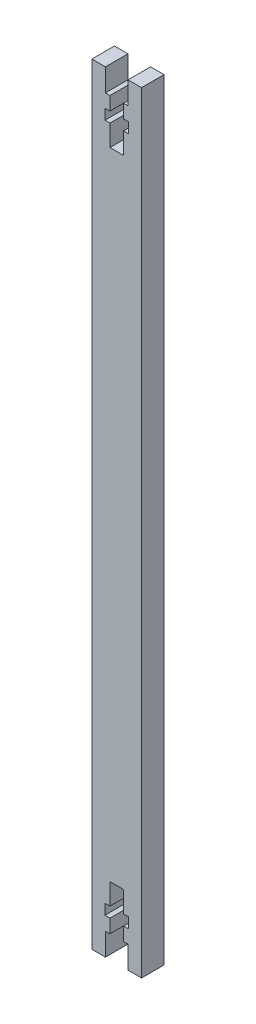
ISO-10303-21;
HEADER;
FILE_DESCRIPTION(('STEP AP214'),'2;1');
FILE_NAME('part.step','',(''),(''),'','','');
FILE_SCHEMA(('AUTOMOTIVE_DESIGN { 1 0 10303 214 1 1 1 1 }'));
ENDSEC;
DATA;
#1=APPLICATION_CONTEXT('core data for automotive mechanical design processes');
#2=APPLICATION_PROTOCOL_DEFINITION('international standard','automotive_design',2000,#1);
#3=PRODUCT_CONTEXT('',#1,'mechanical');
#4=PRODUCT('Part','Part','',(#3));
#5=PRODUCT_RELATED_PRODUCT_CATEGORY('part','',(#4));
#6=PRODUCT_DEFINITION_FORMATION('','',#4);
#7=PRODUCT_DEFINITION_CONTEXT('part definition',#1,'design');
#8=PRODUCT_DEFINITION('design','',#6,#7);
#9=PRODUCT_DEFINITION_SHAPE('','',#8);
#10=(LENGTH_UNIT() NAMED_UNIT(*) SI_UNIT(.MILLI.,.METRE.));
#11=(NAMED_UNIT(*) PLANE_ANGLE_UNIT() SI_UNIT($,.RADIAN.));
#12=(NAMED_UNIT(*) SI_UNIT($,.STERADIAN.) SOLID_ANGLE_UNIT());
#13=UNCERTAINTY_MEASURE_WITH_UNIT(LENGTH_MEASURE(1.E-05),#10,'distance_accuracy_value','');
#14=(GEOMETRIC_REPRESENTATION_CONTEXT(3) GLOBAL_UNCERTAINTY_ASSIGNED_CONTEXT((#13)) GLOBAL_UNIT_ASSIGNED_CONTEXT((#10,
#11,#12)) REPRESENTATION_CONTEXT('',''));
#15=CARTESIAN_POINT('',(0.,0.,0.));
#16=DIRECTION('',(0.,0.,1.));
#17=DIRECTION('',(1.,0.,0.));
#18=AXIS2_PLACEMENT_3D('',#15,#16,#17);
#19=CARTESIAN_POINT('',(-20.,0.,5.));
#20=DIRECTION('',(1.,0.,0.));
#21=DIRECTION('',(0.,0.,-1.));
#22=AXIS2_PLACEMENT_3D('',#19,#20,#21);
#23=PLANE('',#22);
#24=DIRECTION('',(0.,-1.,0.));
#25=VECTOR('',#24,1.);
#26=CARTESIAN_POINT('',(-20.,0.,0.));
#27=LINE('',#26,#25);
#28=CARTESIAN_POINT('',(-20.,171.,0.));
#29=VERTEX_POINT('',#28);
#30=CARTESIAN_POINT('',(-20.,0.,0.));
#31=VERTEX_POINT('',#30);
#32=EDGE_CURVE('E169',#29,#31,#27,.T.);
#33=ORIENTED_EDGE('',*,*,#32,.T.);
#34=DIRECTION('',(0.,0.,-1.));
#35=VECTOR('',#34,1.);
#36=CARTESIAN_POINT('',(-20.,0.,5.));
#37=LINE('',#36,#35);
#38=CARTESIAN_POINT('',(-20.,0.,5.));
#39=VERTEX_POINT('',#38);
#40=EDGE_CURVE('E11',#39,#31,#37,.T.);
#41=ORIENTED_EDGE('',*,*,#40,.F.);
#42=DIRECTION('',(0.,-1.,0.));
#43=VECTOR('',#42,1.);
#44=CARTESIAN_POINT('',(-20.,171.,5.));
#45=LINE('',#44,#43);
#46=CARTESIAN_POINT('',(-20.,171.,5.));
#47=VERTEX_POINT('',#46);
#48=EDGE_CURVE('E175',#47,#39,#45,.T.);
#49=ORIENTED_EDGE('',*,*,#48,.F.);
#50=DIRECTION('',(0.,0.,-1.));
#51=VECTOR('',#50,1.);
#52=CARTESIAN_POINT('',(-20.,171.,5.));
#53=LINE('',#52,#51);
#54=EDGE_CURVE('E293',#47,#29,#53,.T.);
#55=ORIENTED_EDGE('',*,*,#54,.T.);
#56=EDGE_LOOP('',(#33,#41,#49,#55));
#57=FACE_BOUND('',#56,.T.);
#58=ADVANCED_FACE('F33',(#57),#23,.F.);
#59=CARTESIAN_POINT('',(-17.,0.,5.));
#60=DIRECTION('',(0.,1.,0.));
#61=DIRECTION('',(0.,0.,1.));
#62=AXIS2_PLACEMENT_3D('',#59,#60,#61);
#63=PLANE('',#62);
#64=DIRECTION('',(1.,0.,0.));
#65=VECTOR('',#64,1.);
#66=CARTESIAN_POINT('',(-17.,0.,0.));
#67=LINE('',#66,#65);
#68=CARTESIAN_POINT('',(-17.,0.,0.));
#69=VERTEX_POINT('',#68);
#70=EDGE_CURVE('E298',#31,#69,#67,.T.);
#71=ORIENTED_EDGE('',*,*,#70,.T.);
#72=DIRECTION('',(0.,0.,-1.));
#73=VECTOR('',#72,1.);
#74=CARTESIAN_POINT('',(-17.,0.,5.));
#75=LINE('',#74,#73);
#76=CARTESIAN_POINT('',(-17.,0.,5.));
#77=VERTEX_POINT('',#76);
#78=EDGE_CURVE('E41',#77,#69,#75,.T.);
#79=ORIENTED_EDGE('',*,*,#78,.F.);
#80=DIRECTION('',(1.,0.,0.));
#81=VECTOR('',#80,1.);
#82=CARTESIAN_POINT('',(-17.,0.,5.));
#83=LINE('',#82,#81);
#84=EDGE_CURVE('E555',#39,#77,#83,.T.);
#85=ORIENTED_EDGE('',*,*,#84,.F.);
#86=ORIENTED_EDGE('',*,*,#40,.T.);
#87=EDGE_LOOP('',(#71,#79,#85,#86));
#88=FACE_BOUND('',#87,.T.);
#89=ADVANCED_FACE('F558',(#88),#63,.F.);
#90=CARTESIAN_POINT('',(-17.,0.,5.));
#91=DIRECTION('',(-1.,0.,0.));
#92=DIRECTION('',(0.,-1.,0.));
#93=AXIS2_PLACEMENT_3D('',#90,#91,#92);
#94=PLANE('',#93);
#95=DIRECTION('',(0.,1.,0.));
#96=VECTOR('',#95,1.);
#97=CARTESIAN_POINT('',(-17.,0.,0.));
#98=LINE('',#97,#96);
#99=CARTESIAN_POINT('',(-17.,5.,0.));
#100=VERTEX_POINT('',#99);
#101=EDGE_CURVE('E300',#69,#100,#98,.T.);
#102=ORIENTED_EDGE('',*,*,#101,.T.);
#103=DIRECTION('',(0.,0.,-1.));
#104=VECTOR('',#103,1.);
#105=CARTESIAN_POINT('',(-17.,5.,5.));
#106=LINE('',#105,#104);
#107=CARTESIAN_POINT('',(-17.,5.,5.));
#108=VERTEX_POINT('',#107);
#109=EDGE_CURVE('E458',#108,#100,#106,.T.);
#110=ORIENTED_EDGE('',*,*,#109,.F.);
#111=DIRECTION('',(0.,1.,0.));
#112=VECTOR('',#111,1.);
#113=CARTESIAN_POINT('',(-17.,0.,5.));
#114=LINE('',#113,#112);
#115=EDGE_CURVE('E467',#77,#108,#114,.T.);
#116=ORIENTED_EDGE('',*,*,#115,.F.);
#117=ORIENTED_EDGE('',*,*,#78,.T.);
#118=EDGE_LOOP('',(#102,#110,#116,#117));
#119=FACE_BOUND('',#118,.T.);
#120=ADVANCED_FACE('F465',(#119),#94,.F.);
#121=CARTESIAN_POINT('',(-16.,5.,5.));
#122=DIRECTION('',(0.,1.,0.));
#123=DIRECTION('',(-1.,0.,0.));
#124=AXIS2_PLACEMENT_3D('',#121,#122,#123);
#125=PLANE('',#124);
#126=DIRECTION('',(1.,0.,0.));
#127=VECTOR('',#126,1.);
#128=CARTESIAN_POINT('',(-16.,5.,0.));
#129=LINE('',#128,#127);
#130=CARTESIAN_POINT('',(-16.,5.,0.));
#131=VERTEX_POINT('',#130);
#132=EDGE_CURVE('E302',#100,#131,#129,.T.);
#133=ORIENTED_EDGE('',*,*,#132,.T.);
#134=DIRECTION('',(0.,0.,-1.));
#135=VECTOR('',#134,1.);
#136=CARTESIAN_POINT('',(-16.,5.,5.));
#137=LINE('',#136,#135);
#138=CARTESIAN_POINT('',(-16.,5.,5.));
#139=VERTEX_POINT('',#138);
#140=EDGE_CURVE('E455',#139,#131,#137,.T.);
#141=ORIENTED_EDGE('',*,*,#140,.F.);
#142=DIRECTION('',(1.,0.,0.));
#143=VECTOR('',#142,1.);
#144=CARTESIAN_POINT('',(-16.,5.,5.));
#145=LINE('',#144,#143);
#146=EDGE_CURVE('E485',#108,#139,#145,.T.);
#147=ORIENTED_EDGE('',*,*,#146,.F.);
#148=ORIENTED_EDGE('',*,*,#109,.T.);
#149=EDGE_LOOP('',(#133,#141,#147,#148));
#150=FACE_BOUND('',#149,.T.);
#151=ADVANCED_FACE('F476',(#150),#125,.F.);
#152=CARTESIAN_POINT('',(-16.,8.,5.));
#153=DIRECTION('',(-1.,0.,0.));
#154=DIRECTION('',(0.,0.,1.));
#155=AXIS2_PLACEMENT_3D('',#152,#153,#154);
#156=PLANE('',#155);
#157=DIRECTION('',(0.,1.,0.));
#158=VECTOR('',#157,1.);
#159=CARTESIAN_POINT('',(-16.,8.,0.));
#160=LINE('',#159,#158);
#161=CARTESIAN_POINT('',(-16.,8.,0.));
#162=VERTEX_POINT('',#161);
#163=EDGE_CURVE('E304',#131,#162,#160,.T.);
#164=ORIENTED_EDGE('',*,*,#163,.T.);
#165=DIRECTION('',(0.,0.,-1.));
#166=VECTOR('',#165,1.);
#167=CARTESIAN_POINT('',(-16.,8.,5.));
#168=LINE('',#167,#166);
#169=CARTESIAN_POINT('',(-16.,8.,5.));
#170=VERTEX_POINT('',#169);
#171=EDGE_CURVE('E452',#170,#162,#168,.T.);
#172=ORIENTED_EDGE('',*,*,#171,.F.);
#173=DIRECTION('',(0.,1.,0.));
#174=VECTOR('',#173,1.);
#175=CARTESIAN_POINT('',(-16.,8.,5.));
#176=LINE('',#175,#174);
#177=EDGE_CURVE('E482',#139,#170,#176,.T.);
#178=ORIENTED_EDGE('',*,*,#177,.F.);
#179=ORIENTED_EDGE('',*,*,#140,.T.);
#180=EDGE_LOOP('',(#164,#172,#178,#179));
#181=FACE_BOUND('',#180,.T.);
#182=ADVANCED_FACE('F480',(#181),#156,.F.);
#183=CARTESIAN_POINT('',(-16.,8.,5.));
#184=DIRECTION('',(0.,-1.,0.));
#185=DIRECTION('',(0.,0.,-1.));
#186=AXIS2_PLACEMENT_3D('',#183,#184,#185);
#187=PLANE('',#186);
#188=DIRECTION('',(-1.,0.,0.));
#189=VECTOR('',#188,1.);
#190=CARTESIAN_POINT('',(-16.,8.,0.));
#191=LINE('',#190,#189);
#192=CARTESIAN_POINT('',(-17.1,8.,0.));
#193=VERTEX_POINT('',#192);
#194=EDGE_CURVE('E306',#162,#193,#191,.T.);
#195=ORIENTED_EDGE('',*,*,#194,.T.);
#196=DIRECTION('',(0.,0.,-1.));
#197=VECTOR('',#196,1.);
#198=CARTESIAN_POINT('',(-17.1,8.,5.));
#199=LINE('',#198,#197);
#200=CARTESIAN_POINT('',(-17.1,8.,5.));
#201=VERTEX_POINT('',#200);
#202=EDGE_CURVE('E449',#201,#193,#199,.T.);
#203=ORIENTED_EDGE('',*,*,#202,.F.);
#204=DIRECTION('',(-1.,0.,0.));
#205=VECTOR('',#204,1.);
#206=CARTESIAN_POINT('',(-16.,8.,5.));
#207=LINE('',#206,#205);
#208=EDGE_CURVE('E484',#170,#201,#207,.T.);
#209=ORIENTED_EDGE('',*,*,#208,.F.);
#210=ORIENTED_EDGE('',*,*,#171,.T.);
#211=EDGE_LOOP('',(#195,#203,#209,#210));
#212=FACE_BOUND('',#211,.T.);
#213=ADVANCED_FACE('F570',(#212),#187,.F.);
#214=CARTESIAN_POINT('',(-17.1,8.,5.));
#215=DIRECTION('',(-1.,0.,0.));
#216=DIRECTION('',(0.,0.,1.));
#217=AXIS2_PLACEMENT_3D('',#214,#215,#216);
#218=PLANE('',#217);
#219=DIRECTION('',(0.,1.,0.));
#220=VECTOR('',#219,1.);
#221=CARTESIAN_POINT('',(-17.1,8.,0.));
#222=LINE('',#221,#220);
#223=CARTESIAN_POINT('',(-17.1,10.3,0.));
#224=VERTEX_POINT('',#223);
#225=EDGE_CURVE('E308',#193,#224,#222,.T.);
#226=ORIENTED_EDGE('',*,*,#225,.T.);
#227=DIRECTION('',(0.,0.,-1.));
#228=VECTOR('',#227,1.);
#229=CARTESIAN_POINT('',(-17.1,10.3,5.));
#230=LINE('',#229,#228);
#231=CARTESIAN_POINT('',(-17.1,10.3,5.));
#232=VERTEX_POINT('',#231);
#233=EDGE_CURVE('E446',#232,#224,#230,.T.);
#234=ORIENTED_EDGE('',*,*,#233,.F.);
#235=DIRECTION('',(0.,1.,0.));
#236=VECTOR('',#235,1.);
#237=CARTESIAN_POINT('',(-17.1,8.,5.));
#238=LINE('',#237,#236);
#239=EDGE_CURVE('E487',#201,#232,#238,.T.);
#240=ORIENTED_EDGE('',*,*,#239,.F.);
#241=ORIENTED_EDGE('',*,*,#202,.T.);
#242=EDGE_LOOP('',(#226,#234,#240,#241));
#243=FACE_BOUND('',#242,.T.);
#244=ADVANCED_FACE('F573',(#243),#218,.F.);
#245=CARTESIAN_POINT('',(-17.1,10.3,5.));
#246=DIRECTION('',(0.,1.,0.));
#247=DIRECTION('',(0.,0.,1.));
#248=AXIS2_PLACEMENT_3D('',#245,#246,#247);
#249=PLANE('',#248);
#250=DIRECTION('',(1.,0.,0.));
#251=VECTOR('',#250,1.);
#252=CARTESIAN_POINT('',(-17.1,10.3,0.));
#253=LINE('',#252,#251);
#254=CARTESIAN_POINT('',(-16.,10.3,0.));
#255=VERTEX_POINT('',#254);
#256=EDGE_CURVE('E310',#224,#255,#253,.T.);
#257=ORIENTED_EDGE('',*,*,#256,.T.);
#258=DIRECTION('',(0.,0.,-1.));
#259=VECTOR('',#258,1.);
#260=CARTESIAN_POINT('',(-16.,10.3,5.));
#261=LINE('',#260,#259);
#262=CARTESIAN_POINT('',(-16.,10.3,5.));
#263=VERTEX_POINT('',#262);
#264=EDGE_CURVE('E443',#263,#255,#261,.T.);
#265=ORIENTED_EDGE('',*,*,#264,.F.);
#266=DIRECTION('',(1.,0.,0.));
#267=VECTOR('',#266,1.);
#268=CARTESIAN_POINT('',(-17.1,10.3,5.));
#269=LINE('',#268,#267);
#270=EDGE_CURVE('E493',#232,#263,#269,.T.);
#271=ORIENTED_EDGE('',*,*,#270,.F.);
#272=ORIENTED_EDGE('',*,*,#233,.T.);
#273=EDGE_LOOP('',(#257,#265,#271,#272));
#274=FACE_BOUND('',#273,.T.);
#275=ADVANCED_FACE('F577',(#274),#249,.F.);
#276=CARTESIAN_POINT('',(-16.,15.,5.));
#277=DIRECTION('',(-1.,0.,0.));
#278=DIRECTION('',(0.,0.,1.));
#279=AXIS2_PLACEMENT_3D('',#276,#277,#278);
#280=PLANE('',#279);
#281=DIRECTION('',(0.,1.,0.));
#282=VECTOR('',#281,1.);
#283=CARTESIAN_POINT('',(-16.,15.,0.));
#284=LINE('',#283,#282);
#285=CARTESIAN_POINT('',(-16.,15.,0.));
#286=VERTEX_POINT('',#285);
#287=EDGE_CURVE('E312',#255,#286,#284,.T.);
#288=ORIENTED_EDGE('',*,*,#287,.T.);
#289=DIRECTION('',(0.,0.,-1.));
#290=VECTOR('',#289,1.);
#291=CARTESIAN_POINT('',(-16.,15.,5.));
#292=LINE('',#291,#290);
#293=CARTESIAN_POINT('',(-16.,15.,5.));
#294=VERTEX_POINT('',#293);
#295=EDGE_CURVE('E440',#294,#286,#292,.T.);
#296=ORIENTED_EDGE('',*,*,#295,.F.);
#297=DIRECTION('',(0.,1.,0.));
#298=VECTOR('',#297,1.);
#299=CARTESIAN_POINT('',(-16.,15.,5.));
#300=LINE('',#299,#298);
#301=EDGE_CURVE('E495',#263,#294,#300,.T.);
#302=ORIENTED_EDGE('',*,*,#301,.F.);
#303=ORIENTED_EDGE('',*,*,#264,.T.);
#304=EDGE_LOOP('',(#288,#296,#302,#303));
#305=FACE_BOUND('',#304,.T.);
#306=ADVANCED_FACE('F581',(#305),#280,.F.);
#307=CARTESIAN_POINT('',(-13.,15.,5.));
#308=DIRECTION('',(0.,1.,0.));
#309=DIRECTION('',(0.,0.,1.));
#310=AXIS2_PLACEMENT_3D('',#307,#308,#309);
#311=PLANE('',#310);
#312=DIRECTION('',(1.,0.,0.));
#313=VECTOR('',#312,1.);
#314=CARTESIAN_POINT('',(-13.,15.,0.));
#315=LINE('',#314,#313);
#316=CARTESIAN_POINT('',(-13.,15.,0.));
#317=VERTEX_POINT('',#316);
#318=EDGE_CURVE('E314',#286,#317,#315,.T.);
#319=ORIENTED_EDGE('',*,*,#318,.T.);
#320=DIRECTION('',(0.,0.,-1.));
#321=VECTOR('',#320,1.);
#322=CARTESIAN_POINT('',(-13.,15.,5.));
#323=LINE('',#322,#321);
#324=CARTESIAN_POINT('',(-13.,15.,5.));
#325=VERTEX_POINT('',#324);
#326=EDGE_CURVE('E437',#325,#317,#323,.T.);
#327=ORIENTED_EDGE('',*,*,#326,.F.);
#328=DIRECTION('',(1.,0.,0.));
#329=VECTOR('',#328,1.);
#330=CARTESIAN_POINT('',(-13.,15.,5.));
#331=LINE('',#330,#329);
#332=EDGE_CURVE('E497',#294,#325,#331,.T.);
#333=ORIENTED_EDGE('',*,*,#332,.F.);
#334=ORIENTED_EDGE('',*,*,#295,.T.);
#335=EDGE_LOOP('',(#319,#327,#333,#334));
#336=FACE_BOUND('',#335,.T.);
#337=ADVANCED_FACE('F585',(#336),#311,.F.);
#338=CARTESIAN_POINT('',(-13.,10.3,5.));
#339=DIRECTION('',(1.,0.,0.));
#340=DIRECTION('',(0.,0.,-1.));
#341=AXIS2_PLACEMENT_3D('',#338,#339,#340);
#342=PLANE('',#341);
#343=DIRECTION('',(0.,-1.,0.));
#344=VECTOR('',#343,1.);
#345=CARTESIAN_POINT('',(-13.,10.3,0.));
#346=LINE('',#345,#344);
#347=CARTESIAN_POINT('',(-13.,10.3,0.));
#348=VERTEX_POINT('',#347);
#349=EDGE_CURVE('E316',#317,#348,#346,.T.);
#350=ORIENTED_EDGE('',*,*,#349,.T.);
#351=DIRECTION('',(0.,0.,-1.));
#352=VECTOR('',#351,1.);
#353=CARTESIAN_POINT('',(-13.,10.3,5.));
#354=LINE('',#353,#352);
#355=CARTESIAN_POINT('',(-13.,10.3,5.));
#356=VERTEX_POINT('',#355);
#357=EDGE_CURVE('E434',#356,#348,#354,.T.);
#358=ORIENTED_EDGE('',*,*,#357,.F.);
#359=DIRECTION('',(0.,-1.,0.));
#360=VECTOR('',#359,1.);
#361=CARTESIAN_POINT('',(-13.,10.3,5.));
#362=LINE('',#361,#360);
#363=EDGE_CURVE('E499',#325,#356,#362,.T.);
#364=ORIENTED_EDGE('',*,*,#363,.F.);
#365=ORIENTED_EDGE('',*,*,#326,.T.);
#366=EDGE_LOOP('',(#350,#358,#364,#365));
#367=FACE_BOUND('',#366,.T.);
#368=ADVANCED_FACE('F589',(#367),#342,.F.);
#369=CARTESIAN_POINT('',(-13.,10.3,5.));
#370=DIRECTION('',(0.,1.,0.));
#371=DIRECTION('',(0.,0.,1.));
#372=AXIS2_PLACEMENT_3D('',#369,#370,#371);
#373=PLANE('',#372);
#374=DIRECTION('',(1.,0.,0.));
#375=VECTOR('',#374,1.);
#376=CARTESIAN_POINT('',(-13.,10.3,0.));
#377=LINE('',#376,#375);
#378=CARTESIAN_POINT('',(-11.9,10.3,0.));
#379=VERTEX_POINT('',#378);
#380=EDGE_CURVE('E318',#348,#379,#377,.T.);
#381=ORIENTED_EDGE('',*,*,#380,.T.);
#382=DIRECTION('',(0.,0.,-1.));
#383=VECTOR('',#382,1.);
#384=CARTESIAN_POINT('',(-11.9,10.3,5.));
#385=LINE('',#384,#383);
#386=CARTESIAN_POINT('',(-11.9,10.3,5.));
#387=VERTEX_POINT('',#386);
#388=EDGE_CURVE('E431',#387,#379,#385,.T.);
#389=ORIENTED_EDGE('',*,*,#388,.F.);
#390=DIRECTION('',(1.,0.,0.));
#391=VECTOR('',#390,1.);
#392=CARTESIAN_POINT('',(-13.,10.3,5.));
#393=LINE('',#392,#391);
#394=EDGE_CURVE('E501',#356,#387,#393,.T.);
#395=ORIENTED_EDGE('',*,*,#394,.F.);
#396=ORIENTED_EDGE('',*,*,#357,.T.);
#397=EDGE_LOOP('',(#381,#389,#395,#396));
#398=FACE_BOUND('',#397,.T.);
#399=ADVANCED_FACE('F593',(#398),#373,.F.);
#400=CARTESIAN_POINT('',(-11.9,10.3,5.));
#401=DIRECTION('',(1.,0.,0.));
#402=DIRECTION('',(0.,1.,0.));
#403=AXIS2_PLACEMENT_3D('',#400,#401,#402);
#404=PLANE('',#403);
#405=DIRECTION('',(0.,-1.,0.));
#406=VECTOR('',#405,1.);
#407=CARTESIAN_POINT('',(-11.9,10.3,0.));
#408=LINE('',#407,#406);
#409=CARTESIAN_POINT('',(-11.9,8.,0.));
#410=VERTEX_POINT('',#409);
#411=EDGE_CURVE('E320',#379,#410,#408,.T.);
#412=ORIENTED_EDGE('',*,*,#411,.T.);
#413=DIRECTION('',(0.,0.,-1.));
#414=VECTOR('',#413,1.);
#415=CARTESIAN_POINT('',(-11.9,8.,5.));
#416=LINE('',#415,#414);
#417=CARTESIAN_POINT('',(-11.9,8.,5.));
#418=VERTEX_POINT('',#417);
#419=EDGE_CURVE('E428',#418,#410,#416,.T.);
#420=ORIENTED_EDGE('',*,*,#419,.F.);
#421=DIRECTION('',(0.,-1.,0.));
#422=VECTOR('',#421,1.);
#423=CARTESIAN_POINT('',(-11.9,10.3,5.));
#424=LINE('',#423,#422);
#425=EDGE_CURVE('E503',#387,#418,#424,.T.);
#426=ORIENTED_EDGE('',*,*,#425,.F.);
#427=ORIENTED_EDGE('',*,*,#388,.T.);
#428=EDGE_LOOP('',(#412,#420,#426,#427));
#429=FACE_BOUND('',#428,.T.);
#430=ADVANCED_FACE('F597',(#429),#404,.F.);
#431=CARTESIAN_POINT('',(-11.9,8.,5.));
#432=DIRECTION('',(0.,-1.,0.));
#433=DIRECTION('',(0.,0.,-1.));
#434=AXIS2_PLACEMENT_3D('',#431,#432,#433);
#435=PLANE('',#434);
#436=DIRECTION('',(-1.,0.,0.));
#437=VECTOR('',#436,1.);
#438=CARTESIAN_POINT('',(-11.9,8.,0.));
#439=LINE('',#438,#437);
#440=CARTESIAN_POINT('',(-13.,8.,0.));
#441=VERTEX_POINT('',#440);
#442=EDGE_CURVE('E322',#410,#441,#439,.T.);
#443=ORIENTED_EDGE('',*,*,#442,.T.);
#444=DIRECTION('',(0.,0.,-1.));
#445=VECTOR('',#444,1.);
#446=CARTESIAN_POINT('',(-13.,8.,5.));
#447=LINE('',#446,#445);
#448=CARTESIAN_POINT('',(-13.,8.,5.));
#449=VERTEX_POINT('',#448);
#450=EDGE_CURVE('E425',#449,#441,#447,.T.);
#451=ORIENTED_EDGE('',*,*,#450,.F.);
#452=DIRECTION('',(-1.,0.,0.));
#453=VECTOR('',#452,1.);
#454=CARTESIAN_POINT('',(-11.9,8.,5.));
#455=LINE('',#454,#453);
#456=EDGE_CURVE('E505',#418,#449,#455,.T.);
#457=ORIENTED_EDGE('',*,*,#456,.F.);
#458=ORIENTED_EDGE('',*,*,#419,.T.);
#459=EDGE_LOOP('',(#443,#451,#457,#458));
#460=FACE_BOUND('',#459,.T.);
#461=ADVANCED_FACE('F601',(#460),#435,.F.);
#462=CARTESIAN_POINT('',(-13.,5.,5.));
#463=DIRECTION('',(1.,0.,0.));
#464=DIRECTION('',(0.,0.,-1.));
#465=AXIS2_PLACEMENT_3D('',#462,#463,#464);
#466=PLANE('',#465);
#467=DIRECTION('',(0.,-1.,0.));
#468=VECTOR('',#467,1.);
#469=CARTESIAN_POINT('',(-13.,5.,0.));
#470=LINE('',#469,#468);
#471=CARTESIAN_POINT('',(-13.,5.,0.));
#472=VERTEX_POINT('',#471);
#473=EDGE_CURVE('E324',#441,#472,#470,.T.);
#474=ORIENTED_EDGE('',*,*,#473,.T.);
#475=DIRECTION('',(0.,0.,-1.));
#476=VECTOR('',#475,1.);
#477=CARTESIAN_POINT('',(-13.,5.,5.));
#478=LINE('',#477,#476);
#479=CARTESIAN_POINT('',(-13.,5.,5.));
#480=VERTEX_POINT('',#479);
#481=EDGE_CURVE('E422',#480,#472,#478,.T.);
#482=ORIENTED_EDGE('',*,*,#481,.F.);
#483=DIRECTION('',(0.,-1.,0.));
#484=VECTOR('',#483,1.);
#485=CARTESIAN_POINT('',(-13.,5.,5.));
#486=LINE('',#485,#484);
#487=EDGE_CURVE('E507',#449,#480,#486,.T.);
#488=ORIENTED_EDGE('',*,*,#487,.F.);
#489=ORIENTED_EDGE('',*,*,#450,.T.);
#490=EDGE_LOOP('',(#474,#482,#488,#489));
#491=FACE_BOUND('',#490,.T.);
#492=ADVANCED_FACE('F605',(#491),#466,.F.);
#493=CARTESIAN_POINT('',(-13.,5.,5.));
#494=DIRECTION('',(0.,1.,0.));
#495=DIRECTION('',(0.,0.,1.));
#496=AXIS2_PLACEMENT_3D('',#493,#494,#495);
#497=PLANE('',#496);
#498=DIRECTION('',(1.,0.,0.));
#499=VECTOR('',#498,1.);
#500=CARTESIAN_POINT('',(-13.,5.,0.));
#501=LINE('',#500,#499);
#502=CARTESIAN_POINT('',(-12.,5.,0.));
#503=VERTEX_POINT('',#502);
#504=EDGE_CURVE('E326',#472,#503,#501,.T.);
#505=ORIENTED_EDGE('',*,*,#504,.T.);
#506=DIRECTION('',(0.,0.,-1.));
#507=VECTOR('',#506,1.);
#508=CARTESIAN_POINT('',(-12.,5.,5.));
#509=LINE('',#508,#507);
#510=CARTESIAN_POINT('',(-12.,5.,5.));
#511=VERTEX_POINT('',#510);
#512=EDGE_CURVE('E419',#511,#503,#509,.T.);
#513=ORIENTED_EDGE('',*,*,#512,.F.);
#514=DIRECTION('',(1.,0.,0.));
#515=VECTOR('',#514,1.);
#516=CARTESIAN_POINT('',(-13.,5.,5.));
#517=LINE('',#516,#515);
#518=EDGE_CURVE('E509',#480,#511,#517,.T.);
#519=ORIENTED_EDGE('',*,*,#518,.F.);
#520=ORIENTED_EDGE('',*,*,#481,.T.);
#521=EDGE_LOOP('',(#505,#513,#519,#520));
#522=FACE_BOUND('',#521,.T.);
#523=ADVANCED_FACE('F609',(#522),#497,.F.);
#524=CARTESIAN_POINT('',(-12.,5.,5.));
#525=DIRECTION('',(1.,0.,0.));
#526=DIRECTION('',(0.,1.,0.));
#527=AXIS2_PLACEMENT_3D('',#524,#525,#526);
#528=PLANE('',#527);
#529=DIRECTION('',(0.,-1.,0.));
#530=VECTOR('',#529,1.);
#531=CARTESIAN_POINT('',(-12.,5.,0.));
#532=LINE('',#531,#530);
#533=CARTESIAN_POINT('',(-12.,0.,0.));
#534=VERTEX_POINT('',#533);
#535=EDGE_CURVE('E328',#503,#534,#532,.T.);
#536=ORIENTED_EDGE('',*,*,#535,.T.);
#537=DIRECTION('',(0.,0.,-1.));
#538=VECTOR('',#537,1.);
#539=CARTESIAN_POINT('',(-12.,0.,5.));
#540=LINE('',#539,#538);
#541=CARTESIAN_POINT('',(-12.,0.,5.));
#542=VERTEX_POINT('',#541);
#543=EDGE_CURVE('E416',#542,#534,#540,.T.);
#544=ORIENTED_EDGE('',*,*,#543,.F.);
#545=DIRECTION('',(0.,-1.,0.));
#546=VECTOR('',#545,1.);
#547=CARTESIAN_POINT('',(-12.,5.,5.));
#548=LINE('',#547,#546);
#549=EDGE_CURVE('E511',#511,#542,#548,.T.);
#550=ORIENTED_EDGE('',*,*,#549,.F.);
#551=ORIENTED_EDGE('',*,*,#512,.T.);
#552=EDGE_LOOP('',(#536,#544,#550,#551));
#553=FACE_BOUND('',#552,.T.);
#554=ADVANCED_FACE('F613',(#553),#528,.F.);
#555=CARTESIAN_POINT('',(-12.,0.,5.));
#556=DIRECTION('',(0.,1.,0.));
#557=DIRECTION('',(0.,0.,1.));
#558=AXIS2_PLACEMENT_3D('',#555,#556,#557);
#559=PLANE('',#558);
#560=DIRECTION('',(1.,0.,0.));
#561=VECTOR('',#560,1.);
#562=CARTESIAN_POINT('',(-12.,0.,0.));
#563=LINE('',#562,#561);
#564=CARTESIAN_POINT('',(-9.00000000000001,0.,0.));
#565=VERTEX_POINT('',#564);
#566=EDGE_CURVE('E330',#534,#565,#563,.T.);
#567=ORIENTED_EDGE('',*,*,#566,.T.);
#568=DIRECTION('',(0.,0.,-1.));
#569=VECTOR('',#568,1.);
#570=CARTESIAN_POINT('',(-9.00000000000001,0.,5.));
#571=LINE('',#570,#569);
#572=CARTESIAN_POINT('',(-9.00000000000001,0.,5.));
#573=VERTEX_POINT('',#572);
#574=EDGE_CURVE('E413',#573,#565,#571,.T.);
#575=ORIENTED_EDGE('',*,*,#574,.F.);
#576=DIRECTION('',(1.,0.,0.));
#577=VECTOR('',#576,1.);
#578=CARTESIAN_POINT('',(-12.,0.,5.));
#579=LINE('',#578,#577);
#580=EDGE_CURVE('E513',#542,#573,#579,.T.);
#581=ORIENTED_EDGE('',*,*,#580,.F.);
#582=ORIENTED_EDGE('',*,*,#543,.T.);
#583=EDGE_LOOP('',(#567,#575,#581,#582));
#584=FACE_BOUND('',#583,.T.);
#585=ADVANCED_FACE('F617',(#584),#559,.F.);
#586=CARTESIAN_POINT('',(-9.00000000000004,171.,5.));
#587=DIRECTION('',(-1.,0.,0.));
#588=DIRECTION('',(0.,-1.,0.));
#589=AXIS2_PLACEMENT_3D('',#586,#587,#588);
#590=PLANE('',#589);
#591=DIRECTION('',(0.,1.,0.));
#592=VECTOR('',#591,1.);
#593=CARTESIAN_POINT('',(-9.00000000000004,171.,0.));
#594=LINE('',#593,#592);
#595=CARTESIAN_POINT('',(-9.00000000000004,171.,0.));
#596=VERTEX_POINT('',#595);
#597=EDGE_CURVE('E333',#565,#596,#594,.T.);
#598=ORIENTED_EDGE('',*,*,#597,.T.);
#599=DIRECTION('',(0.,0.,-1.));
#600=VECTOR('',#599,1.);
#601=CARTESIAN_POINT('',(-9.00000000000004,171.,5.));
#602=LINE('',#601,#600);
#603=CARTESIAN_POINT('',(-9.00000000000004,171.,5.));
#604=VERTEX_POINT('',#603);
#605=EDGE_CURVE('E410',#604,#596,#602,.T.);
#606=ORIENTED_EDGE('',*,*,#605,.F.);
#607=DIRECTION('',(0.,1.,0.));
#608=VECTOR('',#607,1.);
#609=CARTESIAN_POINT('',(-9.00000000000001,0.,5.));
#610=LINE('',#609,#608);
#611=EDGE_CURVE('E515',#573,#604,#610,.T.);
#612=ORIENTED_EDGE('',*,*,#611,.F.);
#613=ORIENTED_EDGE('',*,*,#574,.T.);
#614=EDGE_LOOP('',(#598,#606,#612,#613));
#615=FACE_BOUND('',#614,.T.);
#616=ADVANCED_FACE('F621',(#615),#590,.F.);
#617=CARTESIAN_POINT('',(-12.,171.,5.));
#618=DIRECTION('',(0.,-1.,0.));
#619=DIRECTION('',(1.,0.,0.));
#620=AXIS2_PLACEMENT_3D('',#617,#618,#619);
#621=PLANE('',#620);
#622=DIRECTION('',(-1.,0.,0.));
#623=VECTOR('',#622,1.);
#624=CARTESIAN_POINT('',(-12.,171.,0.));
#625=LINE('',#624,#623);
#626=CARTESIAN_POINT('',(-12.,171.,0.));
#627=VERTEX_POINT('',#626);
#628=EDGE_CURVE('E335',#596,#627,#625,.T.);
#629=ORIENTED_EDGE('',*,*,#628,.T.);
#630=DIRECTION('',(0.,0.,-1.));
#631=VECTOR('',#630,1.);
#632=CARTESIAN_POINT('',(-12.,171.,5.));
#633=LINE('',#632,#631);
#634=CARTESIAN_POINT('',(-12.,171.,5.));
#635=VERTEX_POINT('',#634);
#636=EDGE_CURVE('E407',#635,#627,#633,.T.);
#637=ORIENTED_EDGE('',*,*,#636,.F.);
#638=DIRECTION('',(-1.,0.,0.));
#639=VECTOR('',#638,1.);
#640=CARTESIAN_POINT('',(-12.,171.,5.));
#641=LINE('',#640,#639);
#642=EDGE_CURVE('E517',#604,#635,#641,.T.);
#643=ORIENTED_EDGE('',*,*,#642,.F.);
#644=ORIENTED_EDGE('',*,*,#605,.T.);
#645=EDGE_LOOP('',(#629,#637,#643,#644));
#646=FACE_BOUND('',#645,.T.);
#647=ADVANCED_FACE('F625',(#646),#621,.F.);
#648=CARTESIAN_POINT('',(-12.,171.,5.));
#649=DIRECTION('',(1.,0.,0.));
#650=DIRECTION('',(0.,1.,0.));
#651=AXIS2_PLACEMENT_3D('',#648,#649,#650);
#652=PLANE('',#651);
#653=DIRECTION('',(0.,-1.,0.));
#654=VECTOR('',#653,1.);
#655=CARTESIAN_POINT('',(-12.,171.,0.));
#656=LINE('',#655,#654);
#657=CARTESIAN_POINT('',(-12.,166.,0.));
#658=VERTEX_POINT('',#657);
#659=EDGE_CURVE('E337',#627,#658,#656,.T.);
#660=ORIENTED_EDGE('',*,*,#659,.T.);
#661=DIRECTION('',(0.,0.,-1.));
#662=VECTOR('',#661,1.);
#663=CARTESIAN_POINT('',(-12.,166.,5.));
#664=LINE('',#663,#662);
#665=CARTESIAN_POINT('',(-12.,166.,5.));
#666=VERTEX_POINT('',#665);
#667=EDGE_CURVE('E404',#666,#658,#664,.T.);
#668=ORIENTED_EDGE('',*,*,#667,.F.);
#669=DIRECTION('',(0.,-1.,0.));
#670=VECTOR('',#669,1.);
#671=CARTESIAN_POINT('',(-12.,171.,5.));
#672=LINE('',#671,#670);
#673=EDGE_CURVE('E519',#635,#666,#672,.T.);
#674=ORIENTED_EDGE('',*,*,#673,.F.);
#675=ORIENTED_EDGE('',*,*,#636,.T.);
#676=EDGE_LOOP('',(#660,#668,#674,#675));
#677=FACE_BOUND('',#676,.T.);
#678=ADVANCED_FACE('F629',(#677),#652,.F.);
#679=CARTESIAN_POINT('',(-13.,166.,5.));
#680=DIRECTION('',(0.,-1.,0.));
#681=DIRECTION('',(0.,0.,-1.));
#682=AXIS2_PLACEMENT_3D('',#679,#680,#681);
#683=PLANE('',#682);
#684=DIRECTION('',(-1.,0.,0.));
#685=VECTOR('',#684,1.);
#686=CARTESIAN_POINT('',(-13.,166.,0.));
#687=LINE('',#686,#685);
#688=CARTESIAN_POINT('',(-13.,166.,0.));
#689=VERTEX_POINT('',#688);
#690=EDGE_CURVE('E339',#658,#689,#687,.T.);
#691=ORIENTED_EDGE('',*,*,#690,.T.);
#692=DIRECTION('',(0.,0.,-1.));
#693=VECTOR('',#692,1.);
#694=CARTESIAN_POINT('',(-13.,166.,5.));
#695=LINE('',#694,#693);
#696=CARTESIAN_POINT('',(-13.,166.,5.));
#697=VERTEX_POINT('',#696);
#698=EDGE_CURVE('E401',#697,#689,#695,.T.);
#699=ORIENTED_EDGE('',*,*,#698,.F.);
#700=DIRECTION('',(-1.,0.,0.));
#701=VECTOR('',#700,1.);
#702=CARTESIAN_POINT('',(-13.,166.,5.));
#703=LINE('',#702,#701);
#704=EDGE_CURVE('E521',#666,#697,#703,.T.);
#705=ORIENTED_EDGE('',*,*,#704,.F.);
#706=ORIENTED_EDGE('',*,*,#667,.T.);
#707=EDGE_LOOP('',(#691,#699,#705,#706));
#708=FACE_BOUND('',#707,.T.);
#709=ADVANCED_FACE('F633',(#708),#683,.F.);
#710=CARTESIAN_POINT('',(-13.,163.,5.));
#711=DIRECTION('',(1.,0.,0.));
#712=DIRECTION('',(0.,0.,-1.));
#713=AXIS2_PLACEMENT_3D('',#710,#711,#712);
#714=PLANE('',#713);
#715=DIRECTION('',(0.,-1.,0.));
#716=VECTOR('',#715,1.);
#717=CARTESIAN_POINT('',(-13.,163.,0.));
#718=LINE('',#717,#716);
#719=CARTESIAN_POINT('',(-13.,163.,0.));
#720=VERTEX_POINT('',#719);
#721=EDGE_CURVE('E341',#689,#720,#718,.T.);
#722=ORIENTED_EDGE('',*,*,#721,.T.);
#723=DIRECTION('',(0.,0.,-1.));
#724=VECTOR('',#723,1.);
#725=CARTESIAN_POINT('',(-13.,163.,5.));
#726=LINE('',#725,#724);
#727=CARTESIAN_POINT('',(-13.,163.,5.));
#728=VERTEX_POINT('',#727);
#729=EDGE_CURVE('E398',#728,#720,#726,.T.);
#730=ORIENTED_EDGE('',*,*,#729,.F.);
#731=DIRECTION('',(0.,-1.,0.));
#732=VECTOR('',#731,1.);
#733=CARTESIAN_POINT('',(-13.,163.,5.));
#734=LINE('',#733,#732);
#735=EDGE_CURVE('E523',#697,#728,#734,.T.);
#736=ORIENTED_EDGE('',*,*,#735,.F.);
#737=ORIENTED_EDGE('',*,*,#698,.T.);
#738=EDGE_LOOP('',(#722,#730,#736,#737));
#739=FACE_BOUND('',#738,.T.);
#740=ADVANCED_FACE('F637',(#739),#714,.F.);
#741=CARTESIAN_POINT('',(-13.,163.,5.));
#742=DIRECTION('',(0.,1.,0.));
#743=DIRECTION('',(0.,0.,1.));
#744=AXIS2_PLACEMENT_3D('',#741,#742,#743);
#745=PLANE('',#744);
#746=DIRECTION('',(1.,0.,0.));
#747=VECTOR('',#746,1.);
#748=CARTESIAN_POINT('',(-13.,163.,0.));
#749=LINE('',#748,#747);
#750=CARTESIAN_POINT('',(-11.9,163.,0.));
#751=VERTEX_POINT('',#750);
#752=EDGE_CURVE('E343',#720,#751,#749,.T.);
#753=ORIENTED_EDGE('',*,*,#752,.T.);
#754=DIRECTION('',(0.,0.,-1.));
#755=VECTOR('',#754,1.);
#756=CARTESIAN_POINT('',(-11.9,163.,5.));
#757=LINE('',#756,#755);
#758=CARTESIAN_POINT('',(-11.9,163.,5.));
#759=VERTEX_POINT('',#758);
#760=EDGE_CURVE('E395',#759,#751,#757,.T.);
#761=ORIENTED_EDGE('',*,*,#760,.F.);
#762=DIRECTION('',(1.,0.,0.));
#763=VECTOR('',#762,1.);
#764=CARTESIAN_POINT('',(-13.,163.,5.));
#765=LINE('',#764,#763);
#766=EDGE_CURVE('E525',#728,#759,#765,.T.);
#767=ORIENTED_EDGE('',*,*,#766,.F.);
#768=ORIENTED_EDGE('',*,*,#729,.T.);
#769=EDGE_LOOP('',(#753,#761,#767,#768));
#770=FACE_BOUND('',#769,.T.);
#771=ADVANCED_FACE('F641',(#770),#745,.F.);
#772=CARTESIAN_POINT('',(-11.9,163.,5.));
#773=DIRECTION('',(1.,0.,0.));
#774=DIRECTION('',(0.,0.,-1.));
#775=AXIS2_PLACEMENT_3D('',#772,#773,#774);
#776=PLANE('',#775);
#777=DIRECTION('',(0.,-1.,0.));
#778=VECTOR('',#777,1.);
#779=CARTESIAN_POINT('',(-11.9,163.,0.));
#780=LINE('',#779,#778);
#781=CARTESIAN_POINT('',(-11.9,160.7,0.));
#782=VERTEX_POINT('',#781);
#783=EDGE_CURVE('E345',#751,#782,#780,.T.);
#784=ORIENTED_EDGE('',*,*,#783,.T.);
#785=DIRECTION('',(0.,0.,-1.));
#786=VECTOR('',#785,1.);
#787=CARTESIAN_POINT('',(-11.9,160.7,5.));
#788=LINE('',#787,#786);
#789=CARTESIAN_POINT('',(-11.9,160.7,5.));
#790=VERTEX_POINT('',#789);
#791=EDGE_CURVE('E392',#790,#782,#788,.T.);
#792=ORIENTED_EDGE('',*,*,#791,.F.);
#793=DIRECTION('',(0.,-1.,0.));
#794=VECTOR('',#793,1.);
#795=CARTESIAN_POINT('',(-11.9,163.,5.));
#796=LINE('',#795,#794);
#797=EDGE_CURVE('E527',#759,#790,#796,.T.);
#798=ORIENTED_EDGE('',*,*,#797,.F.);
#799=ORIENTED_EDGE('',*,*,#760,.T.);
#800=EDGE_LOOP('',(#784,#792,#798,#799));
#801=FACE_BOUND('',#800,.T.);
#802=ADVANCED_FACE('F645',(#801),#776,.F.);
#803=CARTESIAN_POINT('',(-11.9,160.7,5.));
#804=DIRECTION('',(0.,-1.,0.));
#805=DIRECTION('',(0.,0.,-1.));
#806=AXIS2_PLACEMENT_3D('',#803,#804,#805);
#807=PLANE('',#806);
#808=DIRECTION('',(-1.,0.,0.));
#809=VECTOR('',#808,1.);
#810=CARTESIAN_POINT('',(-11.9,160.7,0.));
#811=LINE('',#810,#809);
#812=CARTESIAN_POINT('',(-13.,160.7,0.));
#813=VERTEX_POINT('',#812);
#814=EDGE_CURVE('E347',#782,#813,#811,.T.);
#815=ORIENTED_EDGE('',*,*,#814,.T.);
#816=DIRECTION('',(0.,0.,-1.));
#817=VECTOR('',#816,1.);
#818=CARTESIAN_POINT('',(-13.,160.7,5.));
#819=LINE('',#818,#817);
#820=CARTESIAN_POINT('',(-13.,160.7,5.));
#821=VERTEX_POINT('',#820);
#822=EDGE_CURVE('E389',#821,#813,#819,.T.);
#823=ORIENTED_EDGE('',*,*,#822,.F.);
#824=DIRECTION('',(-1.,0.,0.));
#825=VECTOR('',#824,1.);
#826=CARTESIAN_POINT('',(-11.9,160.7,5.));
#827=LINE('',#826,#825);
#828=EDGE_CURVE('E529',#790,#821,#827,.T.);
#829=ORIENTED_EDGE('',*,*,#828,.F.);
#830=ORIENTED_EDGE('',*,*,#791,.T.);
#831=EDGE_LOOP('',(#815,#823,#829,#830));
#832=FACE_BOUND('',#831,.T.);
#833=ADVANCED_FACE('F649',(#832),#807,.F.);
#834=CARTESIAN_POINT('',(-13.,156.,5.));
#835=DIRECTION('',(1.,0.,0.));
#836=DIRECTION('',(0.,0.,-1.));
#837=AXIS2_PLACEMENT_3D('',#834,#835,#836);
#838=PLANE('',#837);
#839=DIRECTION('',(0.,-1.,0.));
#840=VECTOR('',#839,1.);
#841=CARTESIAN_POINT('',(-13.,156.,0.));
#842=LINE('',#841,#840);
#843=CARTESIAN_POINT('',(-13.,156.,0.));
#844=VERTEX_POINT('',#843);
#845=EDGE_CURVE('E349',#813,#844,#842,.T.);
#846=ORIENTED_EDGE('',*,*,#845,.T.);
#847=DIRECTION('',(0.,0.,-1.));
#848=VECTOR('',#847,1.);
#849=CARTESIAN_POINT('',(-13.,156.,5.));
#850=LINE('',#849,#848);
#851=CARTESIAN_POINT('',(-13.,156.,5.));
#852=VERTEX_POINT('',#851);
#853=EDGE_CURVE('E386',#852,#844,#850,.T.);
#854=ORIENTED_EDGE('',*,*,#853,.F.);
#855=DIRECTION('',(0.,-1.,0.));
#856=VECTOR('',#855,1.);
#857=CARTESIAN_POINT('',(-13.,156.,5.));
#858=LINE('',#857,#856);
#859=EDGE_CURVE('E531',#821,#852,#858,.T.);
#860=ORIENTED_EDGE('',*,*,#859,.F.);
#861=ORIENTED_EDGE('',*,*,#822,.T.);
#862=EDGE_LOOP('',(#846,#854,#860,#861));
#863=FACE_BOUND('',#862,.T.);
#864=ADVANCED_FACE('F653',(#863),#838,.F.);
#865=CARTESIAN_POINT('',(-16.,156.,5.));
#866=DIRECTION('',(0.,-1.,0.));
#867=DIRECTION('',(0.,0.,-1.));
#868=AXIS2_PLACEMENT_3D('',#865,#866,#867);
#869=PLANE('',#868);
#870=DIRECTION('',(-1.,0.,0.));
#871=VECTOR('',#870,1.);
#872=CARTESIAN_POINT('',(-16.,156.,0.));
#873=LINE('',#872,#871);
#874=CARTESIAN_POINT('',(-16.,156.,0.));
#875=VERTEX_POINT('',#874);
#876=EDGE_CURVE('E351',#844,#875,#873,.T.);
#877=ORIENTED_EDGE('',*,*,#876,.T.);
#878=DIRECTION('',(0.,0.,-1.));
#879=VECTOR('',#878,1.);
#880=CARTESIAN_POINT('',(-16.,156.,5.));
#881=LINE('',#880,#879);
#882=CARTESIAN_POINT('',(-16.,156.,5.));
#883=VERTEX_POINT('',#882);
#884=EDGE_CURVE('E383',#883,#875,#881,.T.);
#885=ORIENTED_EDGE('',*,*,#884,.F.);
#886=DIRECTION('',(-1.,0.,0.));
#887=VECTOR('',#886,1.);
#888=CARTESIAN_POINT('',(-16.,156.,5.));
#889=LINE('',#888,#887);
#890=EDGE_CURVE('E533',#852,#883,#889,.T.);
#891=ORIENTED_EDGE('',*,*,#890,.F.);
#892=ORIENTED_EDGE('',*,*,#853,.T.);
#893=EDGE_LOOP('',(#877,#885,#891,#892));
#894=FACE_BOUND('',#893,.T.);
#895=ADVANCED_FACE('F657',(#894),#869,.F.);
#896=CARTESIAN_POINT('',(-16.,160.7,5.));
#897=DIRECTION('',(-1.,0.,0.));
#898=DIRECTION('',(0.,0.,1.));
#899=AXIS2_PLACEMENT_3D('',#896,#897,#898);
#900=PLANE('',#899);
#901=DIRECTION('',(0.,1.,0.));
#902=VECTOR('',#901,1.);
#903=CARTESIAN_POINT('',(-16.,160.7,0.));
#904=LINE('',#903,#902);
#905=CARTESIAN_POINT('',(-16.,160.7,0.));
#906=VERTEX_POINT('',#905);
#907=EDGE_CURVE('E353',#875,#906,#904,.T.);
#908=ORIENTED_EDGE('',*,*,#907,.T.);
#909=DIRECTION('',(0.,0.,-1.));
#910=VECTOR('',#909,1.);
#911=CARTESIAN_POINT('',(-16.,160.7,5.));
#912=LINE('',#911,#910);
#913=CARTESIAN_POINT('',(-16.,160.7,5.));
#914=VERTEX_POINT('',#913);
#915=EDGE_CURVE('E380',#914,#906,#912,.T.);
#916=ORIENTED_EDGE('',*,*,#915,.F.);
#917=DIRECTION('',(0.,1.,0.));
#918=VECTOR('',#917,1.);
#919=CARTESIAN_POINT('',(-16.,160.7,5.));
#920=LINE('',#919,#918);
#921=EDGE_CURVE('E535',#883,#914,#920,.T.);
#922=ORIENTED_EDGE('',*,*,#921,.F.);
#923=ORIENTED_EDGE('',*,*,#884,.T.);
#924=EDGE_LOOP('',(#908,#916,#922,#923));
#925=FACE_BOUND('',#924,.T.);
#926=ADVANCED_FACE('F661',(#925),#900,.F.);
#927=CARTESIAN_POINT('',(-16.,160.7,5.));
#928=DIRECTION('',(0.,-1.,0.));
#929=DIRECTION('',(0.,0.,-1.));
#930=AXIS2_PLACEMENT_3D('',#927,#928,#929);
#931=PLANE('',#930);
#932=DIRECTION('',(-1.,0.,0.));
#933=VECTOR('',#932,1.);
#934=CARTESIAN_POINT('',(-16.,160.7,0.));
#935=LINE('',#934,#933);
#936=CARTESIAN_POINT('',(-17.1,160.7,0.));
#937=VERTEX_POINT('',#936);
#938=EDGE_CURVE('E355',#906,#937,#935,.T.);
#939=ORIENTED_EDGE('',*,*,#938,.T.);
#940=DIRECTION('',(0.,0.,-1.));
#941=VECTOR('',#940,1.);
#942=CARTESIAN_POINT('',(-17.1,160.7,5.));
#943=LINE('',#942,#941);
#944=CARTESIAN_POINT('',(-17.1,160.7,5.));
#945=VERTEX_POINT('',#944);
#946=EDGE_CURVE('E377',#945,#937,#943,.T.);
#947=ORIENTED_EDGE('',*,*,#946,.F.);
#948=DIRECTION('',(-1.,0.,0.));
#949=VECTOR('',#948,1.);
#950=CARTESIAN_POINT('',(-16.,160.7,5.));
#951=LINE('',#950,#949);
#952=EDGE_CURVE('E537',#914,#945,#951,.T.);
#953=ORIENTED_EDGE('',*,*,#952,.F.);
#954=ORIENTED_EDGE('',*,*,#915,.T.);
#955=EDGE_LOOP('',(#939,#947,#953,#954));
#956=FACE_BOUND('',#955,.T.);
#957=ADVANCED_FACE('F665',(#956),#931,.F.);
#958=CARTESIAN_POINT('',(-17.1,160.7,5.));
#959=DIRECTION('',(-1.,0.,0.));
#960=DIRECTION('',(0.,0.,1.));
#961=AXIS2_PLACEMENT_3D('',#958,#959,#960);
#962=PLANE('',#961);
#963=DIRECTION('',(0.,1.,0.));
#964=VECTOR('',#963,1.);
#965=CARTESIAN_POINT('',(-17.1,160.7,0.));
#966=LINE('',#965,#964);
#967=CARTESIAN_POINT('',(-17.1,163.,0.));
#968=VERTEX_POINT('',#967);
#969=EDGE_CURVE('E357',#937,#968,#966,.T.);
#970=ORIENTED_EDGE('',*,*,#969,.T.);
#971=DIRECTION('',(0.,0.,-1.));
#972=VECTOR('',#971,1.);
#973=CARTESIAN_POINT('',(-17.1,163.,5.));
#974=LINE('',#973,#972);
#975=CARTESIAN_POINT('',(-17.1,163.,5.));
#976=VERTEX_POINT('',#975);
#977=EDGE_CURVE('E374',#976,#968,#974,.T.);
#978=ORIENTED_EDGE('',*,*,#977,.F.);
#979=DIRECTION('',(0.,1.,0.));
#980=VECTOR('',#979,1.);
#981=CARTESIAN_POINT('',(-17.1,160.7,5.));
#982=LINE('',#981,#980);
#983=EDGE_CURVE('E539',#945,#976,#982,.T.);
#984=ORIENTED_EDGE('',*,*,#983,.F.);
#985=ORIENTED_EDGE('',*,*,#946,.T.);
#986=EDGE_LOOP('',(#970,#978,#984,#985));
#987=FACE_BOUND('',#986,.T.);
#988=ADVANCED_FACE('F669',(#987),#962,.F.);
#989=CARTESIAN_POINT('',(-17.1,163.,5.));
#990=DIRECTION('',(0.,1.,0.));
#991=DIRECTION('',(0.,0.,1.));
#992=AXIS2_PLACEMENT_3D('',#989,#990,#991);
#993=PLANE('',#992);
#994=DIRECTION('',(1.,0.,0.));
#995=VECTOR('',#994,1.);
#996=CARTESIAN_POINT('',(-17.1,163.,0.));
#997=LINE('',#996,#995);
#998=CARTESIAN_POINT('',(-16.,163.,0.));
#999=VERTEX_POINT('',#998);
#1000=EDGE_CURVE('E359',#968,#999,#997,.T.);
#1001=ORIENTED_EDGE('',*,*,#1000,.T.);
#1002=DIRECTION('',(0.,0.,-1.));
#1003=VECTOR('',#1002,1.);
#1004=CARTESIAN_POINT('',(-16.,163.,5.));
#1005=LINE('',#1004,#1003);
#1006=CARTESIAN_POINT('',(-16.,163.,5.));
#1007=VERTEX_POINT('',#1006);
#1008=EDGE_CURVE('E371',#1007,#999,#1005,.T.);
#1009=ORIENTED_EDGE('',*,*,#1008,.F.);
#1010=DIRECTION('',(1.,0.,0.));
#1011=VECTOR('',#1010,1.);
#1012=CARTESIAN_POINT('',(-17.1,163.,5.));
#1013=LINE('',#1012,#1011);
#1014=EDGE_CURVE('E541',#976,#1007,#1013,.T.);
#1015=ORIENTED_EDGE('',*,*,#1014,.F.);
#1016=ORIENTED_EDGE('',*,*,#977,.T.);
#1017=EDGE_LOOP('',(#1001,#1009,#1015,#1016));
#1018=FACE_BOUND('',#1017,.T.);
#1019=ADVANCED_FACE('F547',(#1018),#993,.F.);
#1020=CARTESIAN_POINT('',(-16.,166.,5.));
#1021=DIRECTION('',(-1.,0.,0.));
#1022=DIRECTION('',(0.,0.,1.));
#1023=AXIS2_PLACEMENT_3D('',#1020,#1021,#1022);
#1024=PLANE('',#1023);
#1025=DIRECTION('',(0.,1.,0.));
#1026=VECTOR('',#1025,1.);
#1027=CARTESIAN_POINT('',(-16.,166.,0.));
#1028=LINE('',#1027,#1026);
#1029=CARTESIAN_POINT('',(-16.,166.,0.));
#1030=VERTEX_POINT('',#1029);
#1031=EDGE_CURVE('E361',#999,#1030,#1028,.T.);
#1032=ORIENTED_EDGE('',*,*,#1031,.T.);
#1033=DIRECTION('',(0.,0.,-1.));
#1034=VECTOR('',#1033,1.);
#1035=CARTESIAN_POINT('',(-16.,166.,5.));
#1036=LINE('',#1035,#1034);
#1037=CARTESIAN_POINT('',(-16.,166.,5.));
#1038=VERTEX_POINT('',#1037);
#1039=EDGE_CURVE('E288',#1038,#1030,#1036,.T.);
#1040=ORIENTED_EDGE('',*,*,#1039,.F.);
#1041=DIRECTION('',(0.,1.,0.));
#1042=VECTOR('',#1041,1.);
#1043=CARTESIAN_POINT('',(-16.,166.,5.));
#1044=LINE('',#1043,#1042);
#1045=EDGE_CURVE('E279',#1007,#1038,#1044,.T.);
#1046=ORIENTED_EDGE('',*,*,#1045,.F.);
#1047=ORIENTED_EDGE('',*,*,#1008,.T.);
#1048=EDGE_LOOP('',(#1032,#1040,#1046,#1047));
#1049=FACE_BOUND('',#1048,.T.);
#1050=ADVANCED_FACE('F551',(#1049),#1024,.F.);
#1051=CARTESIAN_POINT('',(-16.,166.,5.));
#1052=DIRECTION('',(0.,-1.,0.));
#1053=DIRECTION('',(0.,0.,-1.));
#1054=AXIS2_PLACEMENT_3D('',#1051,#1052,#1053);
#1055=PLANE('',#1054);
#1056=DIRECTION('',(-1.,0.,0.));
#1057=VECTOR('',#1056,1.);
#1058=CARTESIAN_POINT('',(-16.,166.,0.));
#1059=LINE('',#1058,#1057);
#1060=CARTESIAN_POINT('',(-17.,166.,0.));
#1061=VERTEX_POINT('',#1060);
#1062=EDGE_CURVE('E287',#1030,#1061,#1059,.T.);
#1063=ORIENTED_EDGE('',*,*,#1062,.T.);
#1064=DIRECTION('',(0.,0.,-1.));
#1065=VECTOR('',#1064,1.);
#1066=CARTESIAN_POINT('',(-17.,166.,5.));
#1067=LINE('',#1066,#1065);
#1068=CARTESIAN_POINT('',(-17.,166.,5.));
#1069=VERTEX_POINT('',#1068);
#1070=EDGE_CURVE('E284',#1069,#1061,#1067,.T.);
#1071=ORIENTED_EDGE('',*,*,#1070,.F.);
#1072=DIRECTION('',(-1.,0.,0.));
#1073=VECTOR('',#1072,1.);
#1074=CARTESIAN_POINT('',(-16.,166.,5.));
#1075=LINE('',#1074,#1073);
#1076=EDGE_CURVE('E273',#1038,#1069,#1075,.T.);
#1077=ORIENTED_EDGE('',*,*,#1076,.F.);
#1078=ORIENTED_EDGE('',*,*,#1039,.T.);
#1079=EDGE_LOOP('',(#1063,#1071,#1077,#1078));
#1080=FACE_BOUND('',#1079,.T.);
#1081=ADVANCED_FACE('F285',(#1080),#1055,.F.);
#1082=CARTESIAN_POINT('',(-17.,166.,5.));
#1083=DIRECTION('',(-1.,0.,0.));
#1084=DIRECTION('',(0.,-1.,0.));
#1085=AXIS2_PLACEMENT_3D('',#1082,#1083,#1084);
#1086=PLANE('',#1085);
#1087=DIRECTION('',(0.,1.,0.));
#1088=VECTOR('',#1087,1.);
#1089=CARTESIAN_POINT('',(-17.,166.,0.));
#1090=LINE('',#1089,#1088);
#1091=CARTESIAN_POINT('',(-17.,171.,0.));
#1092=VERTEX_POINT('',#1091);
#1093=EDGE_CURVE('E162',#1061,#1092,#1090,.T.);
#1094=ORIENTED_EDGE('',*,*,#1093,.T.);
#1095=DIRECTION('',(0.,0.,-1.));
#1096=VECTOR('',#1095,1.);
#1097=CARTESIAN_POINT('',(-17.,171.,5.));
#1098=LINE('',#1097,#1096);
#1099=CARTESIAN_POINT('',(-17.,171.,5.));
#1100=VERTEX_POINT('',#1099);
#1101=EDGE_CURVE('E289',#1100,#1092,#1098,.T.);
#1102=ORIENTED_EDGE('',*,*,#1101,.F.);
#1103=DIRECTION('',(0.,1.,0.));
#1104=VECTOR('',#1103,1.);
#1105=CARTESIAN_POINT('',(-17.,166.,5.));
#1106=LINE('',#1105,#1104);
#1107=EDGE_CURVE('E277',#1069,#1100,#1106,.T.);
#1108=ORIENTED_EDGE('',*,*,#1107,.F.);
#1109=ORIENTED_EDGE('',*,*,#1070,.T.);
#1110=EDGE_LOOP('',(#1094,#1102,#1108,#1109));
#1111=FACE_BOUND('',#1110,.T.);
#1112=ADVANCED_FACE('F291',(#1111),#1086,.F.);
#1113=CARTESIAN_POINT('',(-17.,171.,5.));
#1114=DIRECTION('',(0.,-1.,0.));
#1115=DIRECTION('',(1.,0.,0.));
#1116=AXIS2_PLACEMENT_3D('',#1113,#1114,#1115);
#1117=PLANE('',#1116);
#1118=DIRECTION('',(-1.,0.,0.));
#1119=VECTOR('',#1118,1.);
#1120=CARTESIAN_POINT('',(-17.,171.,0.));
#1121=LINE('',#1120,#1119);
#1122=EDGE_CURVE('E365',#1092,#29,#1121,.T.);
#1123=ORIENTED_EDGE('',*,*,#1122,.T.);
#1124=ORIENTED_EDGE('',*,*,#54,.F.);
#1125=DIRECTION('',(-1.,0.,0.));
#1126=VECTOR('',#1125,1.);
#1127=CARTESIAN_POINT('',(-17.,171.,5.));
#1128=LINE('',#1127,#1126);
#1129=EDGE_CURVE('E49',#1100,#47,#1128,.T.);
#1130=ORIENTED_EDGE('',*,*,#1129,.F.);
#1131=ORIENTED_EDGE('',*,*,#1101,.T.);
#1132=EDGE_LOOP('',(#1123,#1124,#1130,#1131));
#1133=FACE_BOUND('',#1132,.T.);
#1134=ADVANCED_FACE('F553',(#1133),#1117,.F.);
#1135=CARTESIAN_POINT('',(0.,0.,5.));
#1136=DIRECTION('',(0.,0.,-1.));
#1137=DIRECTION('',(-1.,0.,0.));
#1138=AXIS2_PLACEMENT_3D('',#1135,#1136,#1137);
#1139=PLANE('',#1138);
#1140=ORIENTED_EDGE('',*,*,#48,.T.);
#1141=ORIENTED_EDGE('',*,*,#84,.T.);
#1142=ORIENTED_EDGE('',*,*,#115,.T.);
#1143=ORIENTED_EDGE('',*,*,#146,.T.);
#1144=ORIENTED_EDGE('',*,*,#177,.T.);
#1145=ORIENTED_EDGE('',*,*,#208,.T.);
#1146=ORIENTED_EDGE('',*,*,#239,.T.);
#1147=ORIENTED_EDGE('',*,*,#270,.T.);
#1148=ORIENTED_EDGE('',*,*,#301,.T.);
#1149=ORIENTED_EDGE('',*,*,#332,.T.);
#1150=ORIENTED_EDGE('',*,*,#363,.T.);
#1151=ORIENTED_EDGE('',*,*,#394,.T.);
#1152=ORIENTED_EDGE('',*,*,#425,.T.);
#1153=ORIENTED_EDGE('',*,*,#456,.T.);
#1154=ORIENTED_EDGE('',*,*,#487,.T.);
#1155=ORIENTED_EDGE('',*,*,#518,.T.);
#1156=ORIENTED_EDGE('',*,*,#549,.T.);
#1157=ORIENTED_EDGE('',*,*,#580,.T.);
#1158=ORIENTED_EDGE('',*,*,#611,.T.);
#1159=ORIENTED_EDGE('',*,*,#642,.T.);
#1160=ORIENTED_EDGE('',*,*,#673,.T.);
#1161=ORIENTED_EDGE('',*,*,#704,.T.);
#1162=ORIENTED_EDGE('',*,*,#735,.T.);
#1163=ORIENTED_EDGE('',*,*,#766,.T.);
#1164=ORIENTED_EDGE('',*,*,#797,.T.);
#1165=ORIENTED_EDGE('',*,*,#828,.T.);
#1166=ORIENTED_EDGE('',*,*,#859,.T.);
#1167=ORIENTED_EDGE('',*,*,#890,.T.);
#1168=ORIENTED_EDGE('',*,*,#921,.T.);
#1169=ORIENTED_EDGE('',*,*,#952,.T.);
#1170=ORIENTED_EDGE('',*,*,#983,.T.);
#1171=ORIENTED_EDGE('',*,*,#1014,.T.);
#1172=ORIENTED_EDGE('',*,*,#1045,.T.);
#1173=ORIENTED_EDGE('',*,*,#1076,.T.);
#1174=ORIENTED_EDGE('',*,*,#1107,.T.);
#1175=ORIENTED_EDGE('',*,*,#1129,.T.);
#1176=EDGE_LOOP('',(#1140,#1141,#1142,#1143,#1144,#1145,#1146,#1147,#1148,#1149,#1150,#1151,
#1152,#1153,#1154,#1155,#1156,#1157,#1158,#1159,#1160,#1161,#1162,#1163,#1164,#1165,#1166,#1167,
#1168,#1169,#1170,#1171,#1172,#1173,#1174,#1175));
#1177=FACE_BOUND('',#1176,.T.);
#1178=ADVANCED_FACE('F275',(#1177),#1139,.F.);
#1179=CARTESIAN_POINT('',(0.,0.,0.));
#1180=DIRECTION('',(0.,0.,-1.));
#1181=DIRECTION('',(-1.,0.,0.));
#1182=AXIS2_PLACEMENT_3D('',#1179,#1180,#1181);
#1183=PLANE('',#1182);
#1184=ORIENTED_EDGE('',*,*,#32,.F.);
#1185=ORIENTED_EDGE('',*,*,#1122,.F.);
#1186=ORIENTED_EDGE('',*,*,#1093,.F.);
#1187=ORIENTED_EDGE('',*,*,#1062,.F.);
#1188=ORIENTED_EDGE('',*,*,#1031,.F.);
#1189=ORIENTED_EDGE('',*,*,#1000,.F.);
#1190=ORIENTED_EDGE('',*,*,#969,.F.);
#1191=ORIENTED_EDGE('',*,*,#938,.F.);
#1192=ORIENTED_EDGE('',*,*,#907,.F.);
#1193=ORIENTED_EDGE('',*,*,#876,.F.);
#1194=ORIENTED_EDGE('',*,*,#845,.F.);
#1195=ORIENTED_EDGE('',*,*,#814,.F.);
#1196=ORIENTED_EDGE('',*,*,#783,.F.);
#1197=ORIENTED_EDGE('',*,*,#752,.F.);
#1198=ORIENTED_EDGE('',*,*,#721,.F.);
#1199=ORIENTED_EDGE('',*,*,#690,.F.);
#1200=ORIENTED_EDGE('',*,*,#659,.F.);
#1201=ORIENTED_EDGE('',*,*,#628,.F.);
#1202=ORIENTED_EDGE('',*,*,#597,.F.);
#1203=ORIENTED_EDGE('',*,*,#566,.F.);
#1204=ORIENTED_EDGE('',*,*,#535,.F.);
#1205=ORIENTED_EDGE('',*,*,#504,.F.);
#1206=ORIENTED_EDGE('',*,*,#473,.F.);
#1207=ORIENTED_EDGE('',*,*,#442,.F.);
#1208=ORIENTED_EDGE('',*,*,#411,.F.);
#1209=ORIENTED_EDGE('',*,*,#380,.F.);
#1210=ORIENTED_EDGE('',*,*,#349,.F.);
#1211=ORIENTED_EDGE('',*,*,#318,.F.);
#1212=ORIENTED_EDGE('',*,*,#287,.F.);
#1213=ORIENTED_EDGE('',*,*,#256,.F.);
#1214=ORIENTED_EDGE('',*,*,#225,.F.);
#1215=ORIENTED_EDGE('',*,*,#194,.F.);
#1216=ORIENTED_EDGE('',*,*,#163,.F.);
#1217=ORIENTED_EDGE('',*,*,#132,.F.);
#1218=ORIENTED_EDGE('',*,*,#101,.F.);
#1219=ORIENTED_EDGE('',*,*,#70,.F.);
#1220=EDGE_LOOP('',(#1184,#1185,#1186,#1187,#1188,#1189,#1190,#1191,#1192,#1193,#1194,#1195,
#1196,#1197,#1198,#1199,#1200,#1201,#1202,#1203,#1204,#1205,#1206,#1207,#1208,#1209,#1210,#1211,
#1212,#1213,#1214,#1215,#1216,#1217,#1218,#1219));
#1221=FACE_BOUND('',#1220,.T.);
#1222=ADVANCED_FACE('F471',(#1221),#1183,.T.);
#1223=CLOSED_SHELL('',(#58,#89,#120,#151,#182,#213,#244,#275,#306,#337,#368,#399,#430,#461,#492,
#523,#554,#585,#616,#647,#678,#709,#740,#771,#802,#833,#864,#895,#926,#957,#988,#1019,#1050,
#1081,#1112,#1134,#1178,#1222));
#1224=MANIFOLD_SOLID_BREP('B2',#1223);
#1225=ADVANCED_BREP_SHAPE_REPRESENTATION('',(#18,#1224),#14);
#1226=SHAPE_DEFINITION_REPRESENTATION(#9,#1225);
ENDSEC;
END-ISO-10303-21;
